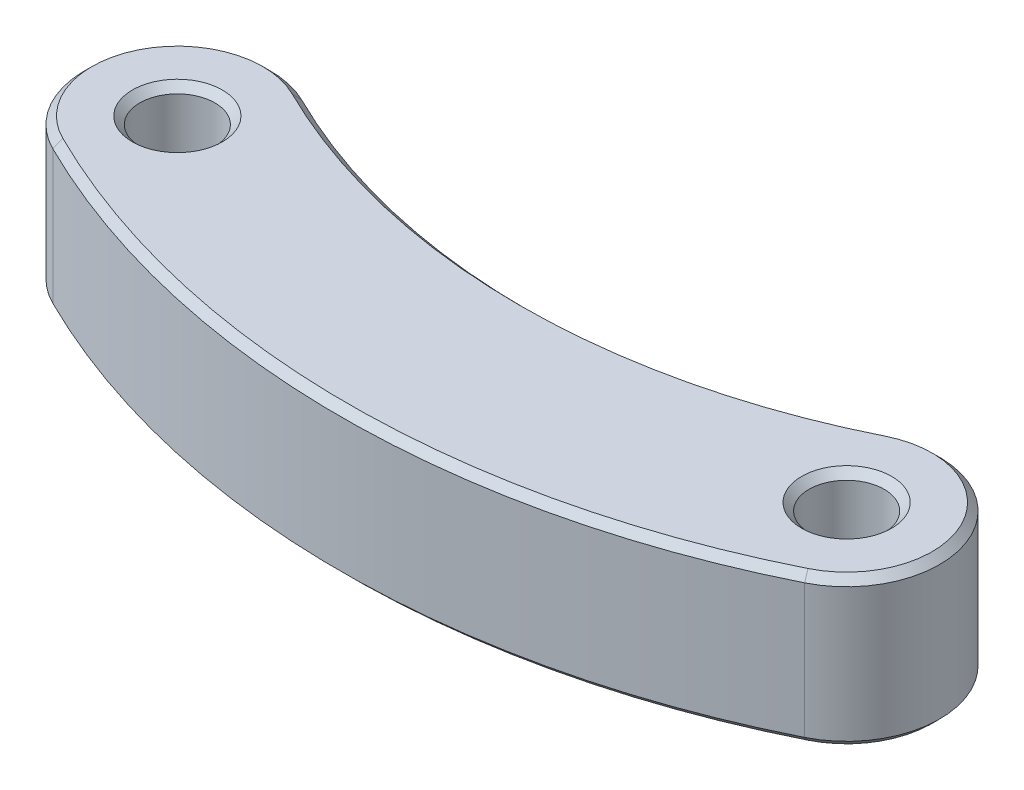
ISO-10303-21;
HEADER;
FILE_DESCRIPTION(('STEP AP214'),'2;1');
FILE_NAME('part.step','',(''),(''),'','','');
FILE_SCHEMA(('AUTOMOTIVE_DESIGN { 1 0 10303 214 1 1 1 1 }'));
ENDSEC;
DATA;
#1=APPLICATION_CONTEXT('core data for automotive mechanical design processes');
#2=APPLICATION_PROTOCOL_DEFINITION('international standard','automotive_design',2000,#1);
#3=PRODUCT_CONTEXT('',#1,'mechanical');
#4=PRODUCT('Part','Part','',(#3));
#5=PRODUCT_RELATED_PRODUCT_CATEGORY('part','',(#4));
#6=PRODUCT_DEFINITION_FORMATION('','',#4);
#7=PRODUCT_DEFINITION_CONTEXT('part definition',#1,'design');
#8=PRODUCT_DEFINITION('design','',#6,#7);
#9=PRODUCT_DEFINITION_SHAPE('','',#8);
#10=(LENGTH_UNIT() NAMED_UNIT(*) SI_UNIT(.MILLI.,.METRE.));
#11=(NAMED_UNIT(*) PLANE_ANGLE_UNIT() SI_UNIT($,.RADIAN.));
#12=(NAMED_UNIT(*) SI_UNIT($,.STERADIAN.) SOLID_ANGLE_UNIT());
#13=UNCERTAINTY_MEASURE_WITH_UNIT(LENGTH_MEASURE(1.E-05),#10,'distance_accuracy_value','');
#14=(GEOMETRIC_REPRESENTATION_CONTEXT(3) GLOBAL_UNCERTAINTY_ASSIGNED_CONTEXT((#13)) GLOBAL_UNIT_ASSIGNED_CONTEXT((#10,
#11,#12)) REPRESENTATION_CONTEXT('',''));
#15=CARTESIAN_POINT('',(0.,0.,0.));
#16=DIRECTION('',(0.,0.,1.));
#17=DIRECTION('',(1.,0.,0.));
#18=AXIS2_PLACEMENT_3D('',#15,#16,#17);
#19=CARTESIAN_POINT('',(2.25,1.,-4.53617793937515));
#20=DIRECTION('',(0.,1.,0.));
#21=DIRECTION('',(0.,0.,1.));
#22=AXIS2_PLACEMENT_3D('',#19,#20,#21);
#23=PLANE('',#22);
#24=CARTESIAN_POINT('',(-4.5,1.,0.));
#25=DIRECTION('',(0.,1.,0.));
#26=DIRECTION('',(0.,0.,1.));
#27=AXIS2_PLACEMENT_3D('',#24,#25,#26);
#28=CIRCLE('',#27,0.604999999999998);
#29=CARTESIAN_POINT('',(-4.5,1.,0.604999999999998));
#30=VERTEX_POINT('',#29);
#31=EDGE_CURVE('E150',#30,#30,#28,.F.);
#32=ORIENTED_EDGE('',*,*,#31,.T.);
#33=EDGE_LOOP('',(#32));
#34=FACE_BOUND('',#33,.T.);
#35=CARTESIAN_POINT('',(4.5,1.,0.));
#36=DIRECTION('',(0.,1.,0.));
#37=DIRECTION('',(0.,0.,1.));
#38=AXIS2_PLACEMENT_3D('',#35,#36,#37);
#39=CIRCLE('',#38,0.604999999999998);
#40=CARTESIAN_POINT('',(4.5,1.,0.604999999999996));
#41=VERTEX_POINT('',#40);
#42=EDGE_CURVE('E147',#41,#41,#39,.F.);
#43=ORIENTED_EDGE('',*,*,#42,.T.);
#44=EDGE_LOOP('',(#43));
#45=FACE_BOUND('',#44,.T.);
#46=CARTESIAN_POINT('',(4.5,1.,0.));
#47=DIRECTION('',(0.,1.,0.));
#48=DIRECTION('',(0.,0.,1.));
#49=AXIS2_PLACEMENT_3D('',#46,#47,#48);
#50=CIRCLE('',#49,1.15);
#51=CARTESIAN_POINT('',(5.0110064034482,1.,1.03022932186719));
#52=VERTEX_POINT('',#51);
#53=CARTESIAN_POINT('',(3.9889935965518,1.,-1.0302293218672));
#54=VERTEX_POINT('',#53);
#55=EDGE_CURVE('E108',#52,#54,#50,.T.);
#56=ORIENTED_EDGE('',*,*,#55,.T.);
#57=CARTESIAN_POINT('',(0.,1.,-9.07235587875031));
#58=DIRECTION('',(0.,1.,0.));
#59=DIRECTION('',(0.,0.,1.));
#60=AXIS2_PLACEMENT_3D('',#57,#58,#59);
#61=CIRCLE('',#60,8.97707466106057);
#62=CARTESIAN_POINT('',(-3.9889935965518,1.,-1.03022932186719));
#63=VERTEX_POINT('',#62);
#64=EDGE_CURVE('E104',#54,#63,#61,.F.);
#65=ORIENTED_EDGE('',*,*,#64,.T.);
#66=CARTESIAN_POINT('',(-4.5,1.,0.));
#67=DIRECTION('',(0.,1.,0.));
#68=DIRECTION('',(0.,0.,1.));
#69=AXIS2_PLACEMENT_3D('',#66,#67,#68);
#70=CIRCLE('',#69,1.15);
#71=CARTESIAN_POINT('',(-5.0110064034482,1.,1.03022932186719));
#72=VERTEX_POINT('',#71);
#73=EDGE_CURVE('E99',#63,#72,#70,.T.);
#74=ORIENTED_EDGE('',*,*,#73,.T.);
#75=CARTESIAN_POINT('',(0.,1.,-9.07235587875031));
#76=DIRECTION('',(0.,1.,0.));
#77=DIRECTION('',(0.,0.,1.));
#78=AXIS2_PLACEMENT_3D('',#75,#76,#77);
#79=CIRCLE('',#78,11.2770746610606);
#80=EDGE_CURVE('E101',#72,#52,#79,.T.);
#81=ORIENTED_EDGE('',*,*,#80,.T.);
#82=EDGE_LOOP('',(#56,#65,#74,#81));
#83=FACE_BOUND('',#82,.T.);
#84=ADVANCED_FACE('F32',(#34,#45,#83),#23,.T.);
#85=CARTESIAN_POINT('',(2.25,-1.,-4.53617793937515));
#86=DIRECTION('',(0.,1.,0.));
#87=DIRECTION('',(0.,0.,1.));
#88=AXIS2_PLACEMENT_3D('',#85,#86,#87);
#89=PLANE('',#88);
#90=CARTESIAN_POINT('',(4.5,-1.,0.));
#91=DIRECTION('',(0.,1.,0.));
#92=DIRECTION('',(0.,0.,1.));
#93=AXIS2_PLACEMENT_3D('',#90,#91,#92);
#94=CIRCLE('',#93,0.605000000000001);
#95=CARTESIAN_POINT('',(4.5,-1.,0.605));
#96=VERTEX_POINT('',#95);
#97=EDGE_CURVE('E11',#96,#96,#94,.T.);
#98=ORIENTED_EDGE('',*,*,#97,.T.);
#99=EDGE_LOOP('',(#98));
#100=FACE_BOUND('',#99,.T.);
#101=CARTESIAN_POINT('',(-4.5,-1.,0.));
#102=DIRECTION('',(0.,1.,0.));
#103=DIRECTION('',(0.,0.,1.));
#104=AXIS2_PLACEMENT_3D('',#101,#102,#103);
#105=CIRCLE('',#104,0.605000000000001);
#106=CARTESIAN_POINT('',(-4.5,-1.,0.605000000000001));
#107=VERTEX_POINT('',#106);
#108=EDGE_CURVE('E40',#107,#107,#105,.T.);
#109=ORIENTED_EDGE('',*,*,#108,.T.);
#110=EDGE_LOOP('',(#109));
#111=FACE_BOUND('',#110,.T.);
#112=CARTESIAN_POINT('',(-4.5,-1.,0.));
#113=DIRECTION('',(0.,1.,0.));
#114=DIRECTION('',(0.,0.,1.));
#115=AXIS2_PLACEMENT_3D('',#112,#113,#114);
#116=CIRCLE('',#115,1.15);
#117=CARTESIAN_POINT('',(-5.0110064034482,-1.,1.03022932186719));
#118=VERTEX_POINT('',#117);
#119=CARTESIAN_POINT('',(-3.9889935965518,-1.,-1.03022932186719));
#120=VERTEX_POINT('',#119);
#121=EDGE_CURVE('E47',#118,#120,#116,.F.);
#122=ORIENTED_EDGE('',*,*,#121,.T.);
#123=CARTESIAN_POINT('',(0.,-1.,-9.07235587875031));
#124=DIRECTION('',(0.,1.,0.));
#125=DIRECTION('',(0.,0.,1.));
#126=AXIS2_PLACEMENT_3D('',#123,#124,#125);
#127=CIRCLE('',#126,8.97707466106058);
#128=CARTESIAN_POINT('',(3.9889935965518,-1.,-1.03022932186719));
#129=VERTEX_POINT('',#128);
#130=EDGE_CURVE('E144',#120,#129,#127,.T.);
#131=ORIENTED_EDGE('',*,*,#130,.T.);
#132=CARTESIAN_POINT('',(4.5,-1.,0.));
#133=DIRECTION('',(0.,1.,0.));
#134=DIRECTION('',(0.,0.,1.));
#135=AXIS2_PLACEMENT_3D('',#132,#133,#134);
#136=CIRCLE('',#135,1.15);
#137=CARTESIAN_POINT('',(5.0110064034482,-1.,1.03022932186719));
#138=VERTEX_POINT('',#137);
#139=EDGE_CURVE('E374',#129,#138,#136,.F.);
#140=ORIENTED_EDGE('',*,*,#139,.T.);
#141=CARTESIAN_POINT('',(0.,-1.,-9.07235587875031));
#142=DIRECTION('',(0.,1.,0.));
#143=DIRECTION('',(0.,0.,1.));
#144=AXIS2_PLACEMENT_3D('',#141,#142,#143);
#145=CIRCLE('',#144,11.2770746610606);
#146=EDGE_CURVE('E370',#138,#118,#145,.F.);
#147=ORIENTED_EDGE('',*,*,#146,.T.);
#148=EDGE_LOOP('',(#122,#131,#140,#147));
#149=FACE_BOUND('',#148,.T.);
#150=ADVANCED_FACE('F161',(#100,#111,#149),#89,.F.);
#151=CARTESIAN_POINT('',(0.,1.,-9.07235587875031));
#152=DIRECTION('',(0.,-1.,0.));
#153=DIRECTION('',(0.,0.,-1.));
#154=AXIS2_PLACEMENT_3D('',#151,#152,#153);
#155=CYLINDRICAL_SURFACE('',#154,8.87707466106058);
#156=DIRECTION('',(0.,-1.,0.));
#157=VECTOR('',#156,1.);
#158=CARTESIAN_POINT('',(-3.94455825712152,1.,-1.11981448029043));
#159=LINE('',#158,#157);
#160=CARTESIAN_POINT('',(-3.94455825712152,0.900000000000002,-1.11981448029043));
#161=VERTEX_POINT('',#160);
#162=CARTESIAN_POINT('',(-3.94455825712152,-0.900000000000001,-1.11981448029043));
#163=VERTEX_POINT('',#162);
#164=EDGE_CURVE('E119',#161,#163,#159,.T.);
#165=ORIENTED_EDGE('',*,*,#164,.F.);
#166=CARTESIAN_POINT('',(0.,0.900000000000002,-9.07235587875031));
#167=DIRECTION('',(0.,1.,0.));
#168=DIRECTION('',(0.,0.,1.));
#169=AXIS2_PLACEMENT_3D('',#166,#167,#168);
#170=CIRCLE('',#169,8.87707466106058);
#171=CARTESIAN_POINT('',(3.94455825712152,0.900000000000002,-1.11981448029043));
#172=VERTEX_POINT('',#171);
#173=EDGE_CURVE('E381',#161,#172,#170,.T.);
#174=ORIENTED_EDGE('',*,*,#173,.T.);
#175=DIRECTION('',(0.,-1.,0.));
#176=VECTOR('',#175,1.);
#177=CARTESIAN_POINT('',(3.94455825712152,1.,-1.11981448029043));
#178=LINE('',#177,#176);
#179=CARTESIAN_POINT('',(3.94455825712152,-0.900000000000001,-1.11981448029043));
#180=VERTEX_POINT('',#179);
#181=EDGE_CURVE('E125',#172,#180,#178,.T.);
#182=ORIENTED_EDGE('',*,*,#181,.T.);
#183=CARTESIAN_POINT('',(0.,-0.900000000000001,-9.07235587875031));
#184=DIRECTION('',(0.,1.,0.));
#185=DIRECTION('',(0.,0.,1.));
#186=AXIS2_PLACEMENT_3D('',#183,#184,#185);
#187=CIRCLE('',#186,8.87707466106058);
#188=EDGE_CURVE('E388',#180,#163,#187,.F.);
#189=ORIENTED_EDGE('',*,*,#188,.T.);
#190=EDGE_LOOP('',(#165,#174,#182,#189));
#191=FACE_BOUND('',#190,.T.);
#192=ADVANCED_FACE('F178',(#191),#155,.F.);
#193=CARTESIAN_POINT('',(-4.5,1.,0.));
#194=DIRECTION('',(0.,-1.,0.));
#195=DIRECTION('',(0.,0.,-1.));
#196=AXIS2_PLACEMENT_3D('',#193,#194,#195);
#197=CYLINDRICAL_SURFACE('',#196,1.25);
#198=DIRECTION('',(0.,-1.,0.));
#199=VECTOR('',#198,1.);
#200=CARTESIAN_POINT('',(-5.05544174287848,1.,1.11981448029043));
#201=LINE('',#200,#199);
#202=CARTESIAN_POINT('',(-5.05544174287848,0.900000000000002,1.11981448029043));
#203=VERTEX_POINT('',#202);
#204=CARTESIAN_POINT('',(-5.05544174287848,-0.900000000000001,1.11981448029043));
#205=VERTEX_POINT('',#204);
#206=EDGE_CURVE('E408',#203,#205,#201,.T.);
#207=ORIENTED_EDGE('',*,*,#206,.F.);
#208=CARTESIAN_POINT('',(-4.5,0.900000000000002,0.));
#209=DIRECTION('',(0.,1.,0.));
#210=DIRECTION('',(0.,0.,1.));
#211=AXIS2_PLACEMENT_3D('',#208,#209,#210);
#212=CIRCLE('',#211,1.25);
#213=EDGE_CURVE('E122',#203,#161,#212,.F.);
#214=ORIENTED_EDGE('',*,*,#213,.T.);
#215=ORIENTED_EDGE('',*,*,#164,.T.);
#216=CARTESIAN_POINT('',(-4.5,-0.900000000000001,0.));
#217=DIRECTION('',(0.,1.,0.));
#218=DIRECTION('',(0.,0.,1.));
#219=AXIS2_PLACEMENT_3D('',#216,#217,#218);
#220=CIRCLE('',#219,1.25);
#221=EDGE_CURVE('E387',#163,#205,#220,.T.);
#222=ORIENTED_EDGE('',*,*,#221,.T.);
#223=EDGE_LOOP('',(#207,#214,#215,#222));
#224=FACE_BOUND('',#223,.T.);
#225=ADVANCED_FACE('F193',(#224),#197,.T.);
#226=CARTESIAN_POINT('',(0.,1.,-9.07235587875031));
#227=DIRECTION('',(0.,-1.,0.));
#228=DIRECTION('',(0.,0.,-1.));
#229=AXIS2_PLACEMENT_3D('',#226,#227,#228);
#230=CYLINDRICAL_SURFACE('',#229,11.3770746610606);
#231=DIRECTION('',(0.,-1.,0.));
#232=VECTOR('',#231,1.);
#233=CARTESIAN_POINT('',(5.05544174287848,1.,1.11981448029043));
#234=LINE('',#233,#232);
#235=CARTESIAN_POINT('',(5.05544174287848,0.900000000000002,1.11981448029043));
#236=VERTEX_POINT('',#235);
#237=CARTESIAN_POINT('',(5.05544174287848,-0.900000000000001,1.11981448029043));
#238=VERTEX_POINT('',#237);
#239=EDGE_CURVE('E405',#236,#238,#234,.T.);
#240=ORIENTED_EDGE('',*,*,#239,.F.);
#241=CARTESIAN_POINT('',(0.,0.900000000000002,-9.07235587875031));
#242=DIRECTION('',(0.,1.,0.));
#243=DIRECTION('',(0.,0.,1.));
#244=AXIS2_PLACEMENT_3D('',#241,#242,#243);
#245=CIRCLE('',#244,11.3770746610606);
#246=EDGE_CURVE('E401',#236,#203,#245,.F.);
#247=ORIENTED_EDGE('',*,*,#246,.T.);
#248=ORIENTED_EDGE('',*,*,#206,.T.);
#249=CARTESIAN_POINT('',(0.,-0.900000000000001,-9.07235587875031));
#250=DIRECTION('',(0.,1.,0.));
#251=DIRECTION('',(0.,0.,1.));
#252=AXIS2_PLACEMENT_3D('',#249,#250,#251);
#253=CIRCLE('',#252,11.3770746610606);
#254=EDGE_CURVE('E371',#205,#238,#253,.T.);
#255=ORIENTED_EDGE('',*,*,#254,.T.);
#256=EDGE_LOOP('',(#240,#247,#248,#255));
#257=FACE_BOUND('',#256,.T.);
#258=ADVANCED_FACE('F189',(#257),#230,.T.);
#259=CARTESIAN_POINT('',(4.5,1.,0.));
#260=DIRECTION('',(0.,-1.,0.));
#261=DIRECTION('',(0.,0.,-1.));
#262=AXIS2_PLACEMENT_3D('',#259,#260,#261);
#263=CYLINDRICAL_SURFACE('',#262,1.25);
#264=ORIENTED_EDGE('',*,*,#181,.F.);
#265=CARTESIAN_POINT('',(4.5,0.900000000000002,0.));
#266=DIRECTION('',(0.,1.,0.));
#267=DIRECTION('',(0.,0.,1.));
#268=AXIS2_PLACEMENT_3D('',#265,#266,#267);
#269=CIRCLE('',#268,1.25);
#270=EDGE_CURVE('E398',#172,#236,#269,.F.);
#271=ORIENTED_EDGE('',*,*,#270,.T.);
#272=ORIENTED_EDGE('',*,*,#239,.T.);
#273=CARTESIAN_POINT('',(4.5,-0.900000000000001,0.));
#274=DIRECTION('',(0.,1.,0.));
#275=DIRECTION('',(0.,0.,1.));
#276=AXIS2_PLACEMENT_3D('',#273,#274,#275);
#277=CIRCLE('',#276,1.25);
#278=EDGE_CURVE('E396',#238,#180,#277,.T.);
#279=ORIENTED_EDGE('',*,*,#278,.T.);
#280=EDGE_LOOP('',(#264,#271,#272,#279));
#281=FACE_BOUND('',#280,.T.);
#282=ADVANCED_FACE('F186',(#281),#263,.T.);
#283=CARTESIAN_POINT('',(-4.5,1.,0.));
#284=DIRECTION('',(0.,-1.,0.));
#285=DIRECTION('',(0.,0.,-1.));
#286=AXIS2_PLACEMENT_3D('',#283,#284,#285);
#287=CYLINDRICAL_SURFACE('',#286,0.505);
#288=CARTESIAN_POINT('',(-4.5,0.900000000000005,0.));
#289=DIRECTION('',(0.,1.,0.));
#290=DIRECTION('',(0.,0.,1.));
#291=AXIS2_PLACEMENT_3D('',#288,#289,#290);
#292=CIRCLE('',#291,0.505);
#293=CARTESIAN_POINT('',(-4.5,0.900000000000005,0.505));
#294=VERTEX_POINT('',#293);
#295=EDGE_CURVE('E143',#294,#294,#292,.T.);
#296=ORIENTED_EDGE('',*,*,#295,.T.);
#297=EDGE_LOOP('',(#296));
#298=FACE_BOUND('',#297,.T.);
#299=CARTESIAN_POINT('',(-4.5,-0.899999999999998,0.));
#300=DIRECTION('',(0.,1.,0.));
#301=DIRECTION('',(0.,0.,1.));
#302=AXIS2_PLACEMENT_3D('',#299,#300,#301);
#303=CIRCLE('',#302,0.505);
#304=CARTESIAN_POINT('',(-4.5,-0.899999999999998,0.505));
#305=VERTEX_POINT('',#304);
#306=EDGE_CURVE('E140',#305,#305,#303,.F.);
#307=ORIENTED_EDGE('',*,*,#306,.T.);
#308=EDGE_LOOP('',(#307));
#309=FACE_BOUND('',#308,.T.);
#310=ADVANCED_FACE('F183',(#298,#309),#287,.F.);
#311=CARTESIAN_POINT('',(4.5,1.,0.));
#312=DIRECTION('',(0.,-1.,0.));
#313=DIRECTION('',(0.,0.,-1.));
#314=AXIS2_PLACEMENT_3D('',#311,#312,#313);
#315=CYLINDRICAL_SURFACE('',#314,0.505);
#316=CARTESIAN_POINT('',(4.5,0.900000000000005,0.));
#317=DIRECTION('',(0.,1.,0.));
#318=DIRECTION('',(0.,0.,1.));
#319=AXIS2_PLACEMENT_3D('',#316,#317,#318);
#320=CIRCLE('',#319,0.505);
#321=CARTESIAN_POINT('',(4.5,0.900000000000005,0.504999999999998));
#322=VERTEX_POINT('',#321);
#323=EDGE_CURVE('E156',#322,#322,#320,.T.);
#324=ORIENTED_EDGE('',*,*,#323,.T.);
#325=EDGE_LOOP('',(#324));
#326=FACE_BOUND('',#325,.T.);
#327=CARTESIAN_POINT('',(4.5,-0.899999999999998,0.));
#328=DIRECTION('',(0.,1.,0.));
#329=DIRECTION('',(0.,0.,1.));
#330=AXIS2_PLACEMENT_3D('',#327,#328,#329);
#331=CIRCLE('',#330,0.505);
#332=CARTESIAN_POINT('',(4.5,-0.899999999999998,0.504999999999998));
#333=VERTEX_POINT('',#332);
#334=EDGE_CURVE('E153',#333,#333,#331,.F.);
#335=ORIENTED_EDGE('',*,*,#334,.T.);
#336=EDGE_LOOP('',(#335));
#337=FACE_BOUND('',#336,.T.);
#338=ADVANCED_FACE('F214',(#326,#337),#315,.F.);
#339=CARTESIAN_POINT('',(0.,1.,-9.07235587875031));
#340=DIRECTION('',(0.,-1.,0.));
#341=DIRECTION('',(0.,0.,-1.));
#342=AXIS2_PLACEMENT_3D('',#339,#340,#341);
#343=CONICAL_SURFACE('',#342,11.2770746610606,0.785398163397448);
#344=DIRECTION('',(0.314205298354763,0.707106781186548,-0.633462730147398));
#345=VECTOR('',#344,1.);
#346=CARTESIAN_POINT('',(-5.05544174287848,0.900000000000002,1.11981448029043));
#347=LINE('',#346,#345);
#348=EDGE_CURVE('E114',#203,#72,#347,.T.);
#349=ORIENTED_EDGE('',*,*,#348,.F.);
#350=ORIENTED_EDGE('',*,*,#246,.F.);
#351=DIRECTION('',(0.314205298354756,-0.707106781186548,0.633462730147401));
#352=VECTOR('',#351,1.);
#353=CARTESIAN_POINT('',(5.0110064034482,1.,1.03022932186719));
#354=LINE('',#353,#352);
#355=EDGE_CURVE('E117',#52,#236,#354,.T.);
#356=ORIENTED_EDGE('',*,*,#355,.F.);
#357=ORIENTED_EDGE('',*,*,#80,.F.);
#358=EDGE_LOOP('',(#349,#350,#356,#357));
#359=FACE_BOUND('',#358,.T.);
#360=ADVANCED_FACE('F112',(#359),#343,.T.);
#361=CARTESIAN_POINT('',(4.5,1.,0.));
#362=DIRECTION('',(0.,-1.,0.));
#363=DIRECTION('',(0.,0.,-1.));
#364=AXIS2_PLACEMENT_3D('',#361,#362,#363);
#365=CONICAL_SURFACE('',#364,1.15,0.785398163397448);
#366=ORIENTED_EDGE('',*,*,#355,.T.);
#367=ORIENTED_EDGE('',*,*,#270,.F.);
#368=DIRECTION('',(-0.314205298354763,-0.707106781186548,-0.633462730147398));
#369=VECTOR('',#368,1.);
#370=CARTESIAN_POINT('',(3.9889935965518,1.,-1.0302293218672));
#371=LINE('',#370,#369);
#372=EDGE_CURVE('E123',#54,#172,#371,.T.);
#373=ORIENTED_EDGE('',*,*,#372,.F.);
#374=ORIENTED_EDGE('',*,*,#55,.F.);
#375=EDGE_LOOP('',(#366,#367,#373,#374));
#376=FACE_BOUND('',#375,.T.);
#377=ADVANCED_FACE('F208',(#376),#365,.T.);
#378=CARTESIAN_POINT('',(-4.5,1.,0.));
#379=DIRECTION('',(0.,-1.,0.));
#380=DIRECTION('',(0.,0.,-1.));
#381=AXIS2_PLACEMENT_3D('',#378,#379,#380);
#382=CONICAL_SURFACE('',#381,1.15,0.785398163397448);
#383=ORIENTED_EDGE('',*,*,#348,.T.);
#384=ORIENTED_EDGE('',*,*,#73,.F.);
#385=DIRECTION('',(-0.314205298354763,0.707106781186548,0.633462730147398));
#386=VECTOR('',#385,1.);
#387=CARTESIAN_POINT('',(-3.94455825712152,0.900000000000002,-1.11981448029043));
#388=LINE('',#387,#386);
#389=EDGE_CURVE('E127',#161,#63,#388,.T.);
#390=ORIENTED_EDGE('',*,*,#389,.F.);
#391=ORIENTED_EDGE('',*,*,#213,.F.);
#392=EDGE_LOOP('',(#383,#384,#390,#391));
#393=FACE_BOUND('',#392,.T.);
#394=ADVANCED_FACE('F121',(#393),#382,.T.);
#395=CARTESIAN_POINT('',(0.,1.,-9.07235587875031));
#396=DIRECTION('',(0.,1.,0.));
#397=DIRECTION('',(0.,0.,1.));
#398=AXIS2_PLACEMENT_3D('',#395,#396,#397);
#399=CONICAL_SURFACE('',#398,8.97707466106057,0.78539816339744);
#400=ORIENTED_EDGE('',*,*,#372,.T.);
#401=ORIENTED_EDGE('',*,*,#173,.F.);
#402=ORIENTED_EDGE('',*,*,#389,.T.);
#403=ORIENTED_EDGE('',*,*,#64,.F.);
#404=EDGE_LOOP('',(#400,#401,#402,#403));
#405=FACE_BOUND('',#404,.T.);
#406=ADVANCED_FACE('F201',(#405),#399,.F.);
#407=CARTESIAN_POINT('',(0.,-0.900000000000001,-9.07235587875031));
#408=DIRECTION('',(0.,1.,0.));
#409=DIRECTION('',(0.,0.,1.));
#410=AXIS2_PLACEMENT_3D('',#407,#408,#409);
#411=CONICAL_SURFACE('',#410,11.3770746610606,0.785398163397457);
#412=DIRECTION('',(-0.314205298354757,0.707106781186548,0.6334627301474));
#413=VECTOR('',#412,1.);
#414=CARTESIAN_POINT('',(-5.0110064034482,-1.,1.03022932186719));
#415=LINE('',#414,#413);
#416=EDGE_CURVE('E134',#118,#205,#415,.T.);
#417=ORIENTED_EDGE('',*,*,#416,.F.);
#418=ORIENTED_EDGE('',*,*,#146,.F.);
#419=DIRECTION('',(-0.314205298354757,-0.707106781186548,-0.6334627301474));
#420=VECTOR('',#419,1.);
#421=CARTESIAN_POINT('',(5.05544174287848,-0.900000000000001,1.11981448029042));
#422=LINE('',#421,#420);
#423=EDGE_CURVE('E137',#238,#138,#422,.T.);
#424=ORIENTED_EDGE('',*,*,#423,.F.);
#425=ORIENTED_EDGE('',*,*,#254,.F.);
#426=EDGE_LOOP('',(#417,#418,#424,#425));
#427=FACE_BOUND('',#426,.T.);
#428=ADVANCED_FACE('F204',(#427),#411,.T.);
#429=CARTESIAN_POINT('',(4.5,-0.900000000000001,0.));
#430=DIRECTION('',(0.,1.,0.));
#431=DIRECTION('',(0.,0.,1.));
#432=AXIS2_PLACEMENT_3D('',#429,#430,#431);
#433=CONICAL_SURFACE('',#432,1.25,0.785398163397449);
#434=ORIENTED_EDGE('',*,*,#423,.T.);
#435=ORIENTED_EDGE('',*,*,#139,.F.);
#436=DIRECTION('',(0.314205298354757,-0.707106781186547,0.633462730147401));
#437=VECTOR('',#436,1.);
#438=CARTESIAN_POINT('',(3.94455825712152,-0.900000000000001,-1.11981448029043));
#439=LINE('',#438,#437);
#440=EDGE_CURVE('E54',#180,#129,#439,.T.);
#441=ORIENTED_EDGE('',*,*,#440,.F.);
#442=ORIENTED_EDGE('',*,*,#278,.F.);
#443=EDGE_LOOP('',(#434,#435,#441,#442));
#444=FACE_BOUND('',#443,.T.);
#445=ADVANCED_FACE('F222',(#444),#433,.T.);
#446=CARTESIAN_POINT('',(-4.5,-0.900000000000001,0.));
#447=DIRECTION('',(0.,1.,0.));
#448=DIRECTION('',(0.,0.,1.));
#449=AXIS2_PLACEMENT_3D('',#446,#447,#448);
#450=CONICAL_SURFACE('',#449,1.25,0.785398163397448);
#451=ORIENTED_EDGE('',*,*,#416,.T.);
#452=ORIENTED_EDGE('',*,*,#221,.F.);
#453=DIRECTION('',(0.314205298354757,0.707106781186548,-0.6334627301474));
#454=VECTOR('',#453,1.);
#455=CARTESIAN_POINT('',(-3.9889935965518,-1.,-1.03022932186719));
#456=LINE('',#455,#454);
#457=EDGE_CURVE('E131',#120,#163,#456,.T.);
#458=ORIENTED_EDGE('',*,*,#457,.F.);
#459=ORIENTED_EDGE('',*,*,#121,.F.);
#460=EDGE_LOOP('',(#451,#452,#458,#459));
#461=FACE_BOUND('',#460,.T.);
#462=ADVANCED_FACE('F219',(#461),#450,.T.);
#463=CARTESIAN_POINT('',(0.,-0.900000000000001,-9.07235587875031));
#464=DIRECTION('',(0.,-1.,0.));
#465=DIRECTION('',(0.,0.,-1.));
#466=AXIS2_PLACEMENT_3D('',#463,#464,#465);
#467=CONICAL_SURFACE('',#466,8.87707466106058,0.785398163397448);
#468=ORIENTED_EDGE('',*,*,#440,.T.);
#469=ORIENTED_EDGE('',*,*,#130,.F.);
#470=ORIENTED_EDGE('',*,*,#457,.T.);
#471=ORIENTED_EDGE('',*,*,#188,.F.);
#472=EDGE_LOOP('',(#468,#469,#470,#471));
#473=FACE_BOUND('',#472,.T.);
#474=ADVANCED_FACE('F215',(#473),#467,.F.);
#475=CARTESIAN_POINT('',(-4.5,0.900000000000005,0.));
#476=DIRECTION('',(0.,1.,0.));
#477=DIRECTION('',(0.,0.,1.));
#478=AXIS2_PLACEMENT_3D('',#475,#476,#477);
#479=CONICAL_SURFACE('',#478,0.505,0.785398163397461);
#480=ORIENTED_EDGE('',*,*,#31,.F.);
#481=EDGE_LOOP('',(#480));
#482=FACE_BOUND('',#481,.T.);
#483=ORIENTED_EDGE('',*,*,#295,.F.);
#484=EDGE_LOOP('',(#483));
#485=FACE_BOUND('',#484,.T.);
#486=ADVANCED_FACE('F218',(#482,#485),#479,.F.);
#487=CARTESIAN_POINT('',(4.5,0.900000000000005,0.));
#488=DIRECTION('',(0.,1.,0.));
#489=DIRECTION('',(0.,0.,1.));
#490=AXIS2_PLACEMENT_3D('',#487,#488,#489);
#491=CONICAL_SURFACE('',#490,0.505,0.785398163397461);
#492=ORIENTED_EDGE('',*,*,#42,.F.);
#493=EDGE_LOOP('',(#492));
#494=FACE_BOUND('',#493,.T.);
#495=ORIENTED_EDGE('',*,*,#323,.F.);
#496=EDGE_LOOP('',(#495));
#497=FACE_BOUND('',#496,.T.);
#498=ADVANCED_FACE('F169',(#494,#497),#491,.F.);
#499=CARTESIAN_POINT('',(4.5,-1.,0.));
#500=DIRECTION('',(0.,-1.,0.));
#501=DIRECTION('',(0.,0.,-1.));
#502=AXIS2_PLACEMENT_3D('',#499,#500,#501);
#503=CONICAL_SURFACE('',#502,0.605000000000001,0.785398163397448);
#504=ORIENTED_EDGE('',*,*,#334,.F.);
#505=EDGE_LOOP('',(#504));
#506=FACE_BOUND('',#505,.T.);
#507=ORIENTED_EDGE('',*,*,#97,.F.);
#508=EDGE_LOOP('',(#507));
#509=FACE_BOUND('',#508,.T.);
#510=ADVANCED_FACE('F164',(#506,#509),#503,.F.);
#511=CARTESIAN_POINT('',(-4.5,-1.,0.));
#512=DIRECTION('',(0.,-1.,0.));
#513=DIRECTION('',(0.,0.,-1.));
#514=AXIS2_PLACEMENT_3D('',#511,#512,#513);
#515=CONICAL_SURFACE('',#514,0.605000000000001,0.785398163397448);
#516=ORIENTED_EDGE('',*,*,#306,.F.);
#517=EDGE_LOOP('',(#516));
#518=FACE_BOUND('',#517,.T.);
#519=ORIENTED_EDGE('',*,*,#108,.F.);
#520=EDGE_LOOP('',(#519));
#521=FACE_BOUND('',#520,.T.);
#522=ADVANCED_FACE('F34',(#518,#521),#515,.F.);
#523=CLOSED_SHELL('',(#84,#150,#192,#225,#258,#282,#310,#338,#360,#377,#394,#406,#428,#445,#462,
#474,#486,#498,#510,#522));
#524=MANIFOLD_SOLID_BREP('B2',#523);
#525=ADVANCED_BREP_SHAPE_REPRESENTATION('',(#18,#524),#14);
#526=SHAPE_DEFINITION_REPRESENTATION(#9,#525);
ENDSEC;
END-ISO-10303-21;
